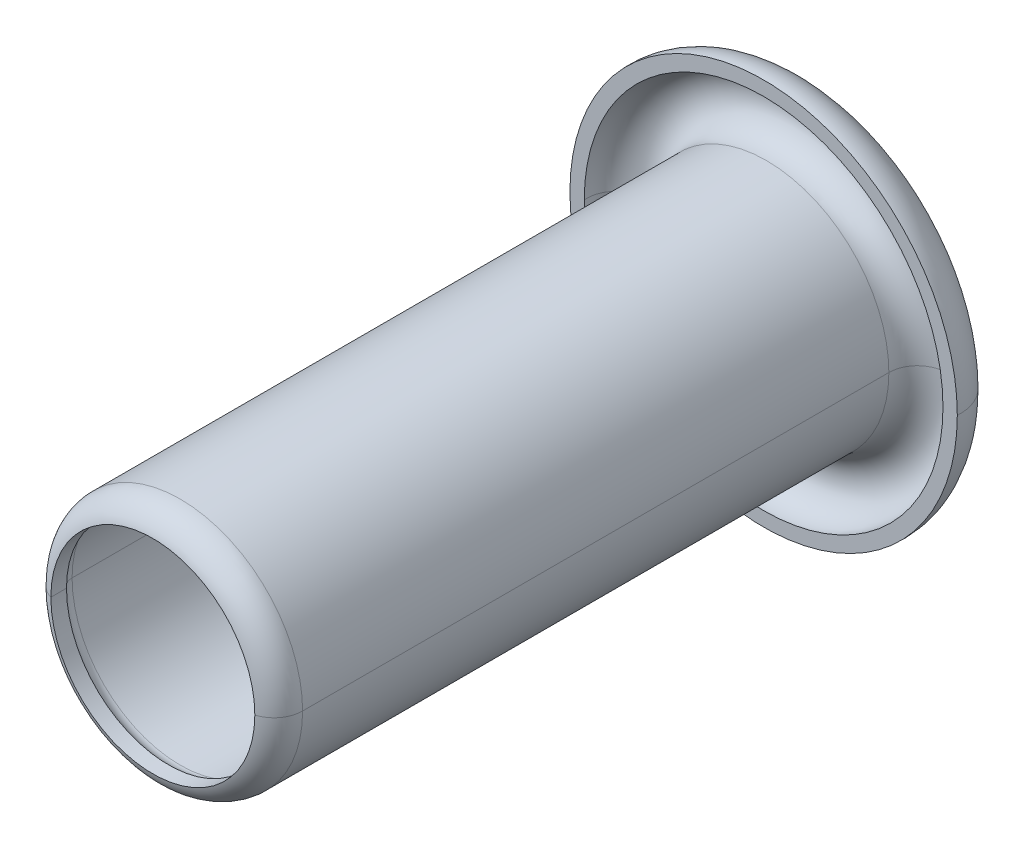
ISO-10303-21;
HEADER;
FILE_DESCRIPTION(('STEP AP214'),'2;1');
FILE_NAME('part.step','',(''),(''),'','','');
FILE_SCHEMA(('AUTOMOTIVE_DESIGN { 1 0 10303 214 1 1 1 1 }'));
ENDSEC;
DATA;
#1=APPLICATION_CONTEXT('core data for automotive mechanical design processes');
#2=APPLICATION_PROTOCOL_DEFINITION('international standard','automotive_design',2000,#1);
#3=PRODUCT_CONTEXT('',#1,'mechanical');
#4=PRODUCT('Part','Part','',(#3));
#5=PRODUCT_RELATED_PRODUCT_CATEGORY('part','',(#4));
#6=PRODUCT_DEFINITION_FORMATION('','',#4);
#7=PRODUCT_DEFINITION_CONTEXT('part definition',#1,'design');
#8=PRODUCT_DEFINITION('design','',#6,#7);
#9=PRODUCT_DEFINITION_SHAPE('','',#8);
#10=(LENGTH_UNIT() NAMED_UNIT(*) SI_UNIT(.MILLI.,.METRE.));
#11=(NAMED_UNIT(*) PLANE_ANGLE_UNIT() SI_UNIT($,.RADIAN.));
#12=(NAMED_UNIT(*) SI_UNIT($,.STERADIAN.) SOLID_ANGLE_UNIT());
#13=UNCERTAINTY_MEASURE_WITH_UNIT(LENGTH_MEASURE(1.E-05),#10,'distance_accuracy_value','');
#14=(GEOMETRIC_REPRESENTATION_CONTEXT(3) GLOBAL_UNCERTAINTY_ASSIGNED_CONTEXT((#13)) GLOBAL_UNIT_ASSIGNED_CONTEXT((#10,
#11,#12)) REPRESENTATION_CONTEXT('',''));
#15=CARTESIAN_POINT('',(0.,0.,0.));
#16=DIRECTION('',(0.,0.,1.));
#17=DIRECTION('',(1.,0.,0.));
#18=AXIS2_PLACEMENT_3D('',#15,#16,#17);
#19=CARTESIAN_POINT('',(-32.,0.,-110.02));
#20=DIRECTION('',(0.,0.,-1.));
#21=DIRECTION('',(-1.,0.,0.));
#22=AXIS2_PLACEMENT_3D('',#19,#20,#21);
#23=CYLINDRICAL_SURFACE('',#22,2.5);
#24=DIRECTION('',(0.,0.,-1.));
#25=VECTOR('',#24,1.);
#26=CARTESIAN_POINT('',(-29.5,0.,-110.02));
#27=LINE('',#26,#25);
#28=CARTESIAN_POINT('',(-29.5,0.,-93.9291796067501));
#29=VERTEX_POINT('',#28);
#30=CARTESIAN_POINT('',(-29.5,0.,-94.3127718676731));
#31=VERTEX_POINT('',#30);
#32=EDGE_CURVE('E119',#29,#31,#27,.T.);
#33=ORIENTED_EDGE('',*,*,#32,.F.);
#34=CARTESIAN_POINT('',(-32.,0.,-93.9291796067501));
#35=DIRECTION('',(0.,0.,-1.));
#36=DIRECTION('',(-1.,0.,0.));
#37=AXIS2_PLACEMENT_3D('',#34,#35,#36);
#38=CIRCLE('',#37,2.5);
#39=CARTESIAN_POINT('',(-34.5,0.,-93.9291796067501));
#40=VERTEX_POINT('',#39);
#41=EDGE_CURVE('E107',#40,#29,#38,.T.);
#42=ORIENTED_EDGE('',*,*,#41,.F.);
#43=DIRECTION('',(0.,0.,-1.));
#44=VECTOR('',#43,1.);
#45=CARTESIAN_POINT('',(-34.5,0.,-110.02));
#46=LINE('',#45,#44);
#47=CARTESIAN_POINT('',(-34.5,0.,-94.3127718676731));
#48=VERTEX_POINT('',#47);
#49=EDGE_CURVE('E128',#40,#48,#46,.T.);
#50=ORIENTED_EDGE('',*,*,#49,.T.);
#51=CARTESIAN_POINT('',(-32.,0.,-94.3127718676731));
#52=DIRECTION('',(0.,0.,1.));
#53=DIRECTION('',(-1.,0.,0.));
#54=AXIS2_PLACEMENT_3D('',#51,#52,#53);
#55=CIRCLE('',#54,2.5);
#56=EDGE_CURVE('E120',#31,#48,#55,.T.);
#57=ORIENTED_EDGE('',*,*,#56,.F.);
#58=EDGE_LOOP('',(#33,#42,#50,#57));
#59=FACE_BOUND('',#58,.T.);
#60=ADVANCED_FACE('F17',(#59),#23,.F.);
#61=CARTESIAN_POINT('',(-32.,4.39649120597465,-108.9));
#62=DIRECTION('',(0.,0.,1.));
#63=DIRECTION('',(0.,1.,0.));
#64=AXIS2_PLACEMENT_3D('',#61,#62,#63);
#65=PLANE('',#64);
#66=CARTESIAN_POINT('',(-32.,0.,-108.9));
#67=DIRECTION('',(0.,0.,1.));
#68=DIRECTION('',(1.,0.,0.));
#69=AXIS2_PLACEMENT_3D('',#66,#67,#68);
#70=CIRCLE('',#69,4.39649120597463);
#71=CARTESIAN_POINT('',(-27.6035087940254,0.,-108.9));
#72=VERTEX_POINT('',#71);
#73=CARTESIAN_POINT('',(-36.3964912059746,0.,-108.9));
#74=VERTEX_POINT('',#73);
#75=EDGE_CURVE('E11',#72,#74,#70,.T.);
#76=ORIENTED_EDGE('',*,*,#75,.F.);
#77=CARTESIAN_POINT('',(-32.,0.,-108.9));
#78=DIRECTION('',(0.,0.,1.));
#79=DIRECTION('',(1.,0.,0.));
#80=AXIS2_PLACEMENT_3D('',#77,#78,#79);
#81=CIRCLE('',#80,4.39649120597463);
#82=EDGE_CURVE('E153',#74,#72,#81,.T.);
#83=ORIENTED_EDGE('',*,*,#82,.F.);
#84=EDGE_LOOP('',(#76,#83));
#85=FACE_BOUND('',#84,.T.);
#86=CARTESIAN_POINT('',(-32.,0.,-108.9));
#87=DIRECTION('',(0.,0.,1.));
#88=DIRECTION('',(1.,0.,0.));
#89=AXIS2_PLACEMENT_3D('',#86,#87,#88);
#90=CIRCLE('',#89,4.7476640682967);
#91=CARTESIAN_POINT('',(-27.2523359317033,0.,-108.9));
#92=VERTEX_POINT('',#91);
#93=CARTESIAN_POINT('',(-36.7476640682967,0.,-108.9));
#94=VERTEX_POINT('',#93);
#95=EDGE_CURVE('E191',#92,#94,#90,.T.);
#96=ORIENTED_EDGE('',*,*,#95,.T.);
#97=CARTESIAN_POINT('',(-32.,0.,-108.9));
#98=DIRECTION('',(0.,0.,1.));
#99=DIRECTION('',(1.,0.,0.));
#100=AXIS2_PLACEMENT_3D('',#97,#98,#99);
#101=CIRCLE('',#100,4.7476640682967);
#102=EDGE_CURVE('E26',#94,#92,#101,.T.);
#103=ORIENTED_EDGE('',*,*,#102,.T.);
#104=EDGE_LOOP('',(#96,#103));
#105=FACE_BOUND('',#104,.T.);
#106=ADVANCED_FACE('F260',(#85,#105),#65,.T.);
#107=CARTESIAN_POINT('',(-32.,0.,-108.97));
#108=DIRECTION('',(0.,0.,1.));
#109=DIRECTION('',(1.,0.,0.));
#110=AXIS2_PLACEMENT_3D('',#107,#108,#109);
#111=TOROIDAL_SURFACE('',#110,3.7,0.7);
#112=CARTESIAN_POINT('',(-35.7,0.,-108.97));
#113=DIRECTION('',(0.,1.,0.));
#114=DIRECTION('',(-1.,0.,0.));
#115=AXIS2_PLACEMENT_3D('',#112,#113,#114);
#116=CIRCLE('',#115,0.7);
#117=CARTESIAN_POINT('',(-35.,0.,-108.97));
#118=VERTEX_POINT('',#117);
#119=EDGE_CURVE('E136',#118,#74,#116,.T.);
#120=ORIENTED_EDGE('',*,*,#119,.F.);
#121=CARTESIAN_POINT('',(-32.,0.,-108.97));
#122=DIRECTION('',(0.,0.,1.));
#123=DIRECTION('',(1.,0.,0.));
#124=AXIS2_PLACEMENT_3D('',#121,#122,#123);
#125=CIRCLE('',#124,3.);
#126=CARTESIAN_POINT('',(-29.,0.,-108.97));
#127=VERTEX_POINT('',#126);
#128=EDGE_CURVE('E164',#127,#118,#125,.T.);
#129=ORIENTED_EDGE('',*,*,#128,.F.);
#130=CARTESIAN_POINT('',(-28.3,0.,-108.97));
#131=DIRECTION('',(0.,-1.,0.));
#132=DIRECTION('',(1.,0.,0.));
#133=AXIS2_PLACEMENT_3D('',#130,#131,#132);
#134=CIRCLE('',#133,0.7);
#135=EDGE_CURVE('E157',#127,#72,#134,.T.);
#136=ORIENTED_EDGE('',*,*,#135,.T.);
#137=ORIENTED_EDGE('',*,*,#75,.T.);
#138=EDGE_LOOP('',(#120,#129,#136,#137));
#139=FACE_BOUND('',#138,.T.);
#140=ADVANCED_FACE('F265',(#139),#111,.F.);
#141=CARTESIAN_POINT('',(-32.,0.,-93.9));
#142=DIRECTION('',(0.,0.,1.));
#143=DIRECTION('',(1.,0.,0.));
#144=AXIS2_PLACEMENT_3D('',#141,#142,#143);
#145=CYLINDRICAL_SURFACE('',#144,3.);
#146=DIRECTION('',(0.,0.,1.));
#147=VECTOR('',#146,1.);
#148=CARTESIAN_POINT('',(-35.,0.,-93.9));
#149=LINE('',#148,#147);
#150=CARTESIAN_POINT('',(-35.,0.,-94.6));
#151=VERTEX_POINT('',#150);
#152=EDGE_CURVE('E152',#118,#151,#149,.T.);
#153=ORIENTED_EDGE('',*,*,#152,.F.);
#154=CARTESIAN_POINT('',(-32.,0.,-108.97));
#155=DIRECTION('',(0.,0.,1.));
#156=DIRECTION('',(1.,0.,0.));
#157=AXIS2_PLACEMENT_3D('',#154,#155,#156);
#158=CIRCLE('',#157,3.);
#159=EDGE_CURVE('E144',#118,#127,#158,.T.);
#160=ORIENTED_EDGE('',*,*,#159,.T.);
#161=DIRECTION('',(0.,0.,1.));
#162=VECTOR('',#161,1.);
#163=CARTESIAN_POINT('',(-29.,0.,-93.9));
#164=LINE('',#163,#162);
#165=CARTESIAN_POINT('',(-29.,0.,-94.6));
#166=VERTEX_POINT('',#165);
#167=EDGE_CURVE('E151',#127,#166,#164,.T.);
#168=ORIENTED_EDGE('',*,*,#167,.T.);
#169=CARTESIAN_POINT('',(-32.,0.,-94.6));
#170=DIRECTION('',(0.,0.,1.));
#171=DIRECTION('',(1.,0.,0.));
#172=AXIS2_PLACEMENT_3D('',#169,#170,#171);
#173=CIRCLE('',#172,3.);
#174=EDGE_CURVE('E101',#151,#166,#173,.T.);
#175=ORIENTED_EDGE('',*,*,#174,.F.);
#176=EDGE_LOOP('',(#153,#160,#168,#175));
#177=FACE_BOUND('',#176,.T.);
#178=ADVANCED_FACE('F329',(#177),#145,.T.);
#179=CARTESIAN_POINT('',(-32.,0.,-93.9));
#180=DIRECTION('',(0.,0.,1.));
#181=DIRECTION('',(1.,0.,0.));
#182=AXIS2_PLACEMENT_3D('',#179,#180,#181);
#183=CYLINDRICAL_SURFACE('',#182,2.65);
#184=DIRECTION('',(0.,0.,1.));
#185=VECTOR('',#184,1.);
#186=CARTESIAN_POINT('',(-34.65,0.,-93.9));
#187=LINE('',#186,#185);
#188=CARTESIAN_POINT('',(-34.65,0.,-108.97));
#189=VERTEX_POINT('',#188);
#190=CARTESIAN_POINT('',(-34.65,0.,-94.6));
#191=VERTEX_POINT('',#190);
#192=EDGE_CURVE('E168',#189,#191,#187,.T.);
#193=ORIENTED_EDGE('',*,*,#192,.F.);
#194=CARTESIAN_POINT('',(-32.,0.,-108.97));
#195=DIRECTION('',(0.,0.,1.));
#196=DIRECTION('',(1.,0.,0.));
#197=AXIS2_PLACEMENT_3D('',#194,#195,#196);
#198=CIRCLE('',#197,2.65);
#199=CARTESIAN_POINT('',(-29.35,0.,-108.97));
#200=VERTEX_POINT('',#199);
#201=EDGE_CURVE('E183',#200,#189,#198,.T.);
#202=ORIENTED_EDGE('',*,*,#201,.F.);
#203=DIRECTION('',(0.,0.,1.));
#204=VECTOR('',#203,1.);
#205=CARTESIAN_POINT('',(-29.35,0.,-93.9));
#206=LINE('',#205,#204);
#207=CARTESIAN_POINT('',(-29.35,0.,-94.6));
#208=VERTEX_POINT('',#207);
#209=EDGE_CURVE('E179',#200,#208,#206,.T.);
#210=ORIENTED_EDGE('',*,*,#209,.T.);
#211=CARTESIAN_POINT('',(-32.,0.,-94.6));
#212=DIRECTION('',(0.,0.,1.));
#213=DIRECTION('',(1.,0.,0.));
#214=AXIS2_PLACEMENT_3D('',#211,#212,#213);
#215=CIRCLE('',#214,2.65);
#216=EDGE_CURVE('E205',#208,#191,#215,.T.);
#217=ORIENTED_EDGE('',*,*,#216,.T.);
#218=EDGE_LOOP('',(#193,#202,#210,#217));
#219=FACE_BOUND('',#218,.T.);
#220=ADVANCED_FACE('F296',(#219),#183,.F.);
#221=CARTESIAN_POINT('',(-32.,0.,-108.97));
#222=DIRECTION('',(0.,0.,1.));
#223=DIRECTION('',(1.,0.,0.));
#224=AXIS2_PLACEMENT_3D('',#221,#222,#223);
#225=TOROIDAL_SURFACE('',#224,3.7,1.05);
#226=CARTESIAN_POINT('',(-35.7,0.,-108.97));
#227=DIRECTION('',(0.,1.,0.));
#228=DIRECTION('',(-1.,0.,0.));
#229=AXIS2_PLACEMENT_3D('',#226,#227,#228);
#230=CIRCLE('',#229,1.05);
#231=EDGE_CURVE('E187',#189,#94,#230,.T.);
#232=ORIENTED_EDGE('',*,*,#231,.F.);
#233=CARTESIAN_POINT('',(-32.,0.,-108.97));
#234=DIRECTION('',(0.,0.,1.));
#235=DIRECTION('',(1.,0.,0.));
#236=AXIS2_PLACEMENT_3D('',#233,#234,#235);
#237=CIRCLE('',#236,2.65);
#238=EDGE_CURVE('E160',#189,#200,#237,.T.);
#239=ORIENTED_EDGE('',*,*,#238,.T.);
#240=CARTESIAN_POINT('',(-28.3,0.,-108.97));
#241=DIRECTION('',(0.,-1.,0.));
#242=DIRECTION('',(1.,0.,0.));
#243=AXIS2_PLACEMENT_3D('',#240,#241,#242);
#244=CIRCLE('',#243,1.05);
#245=EDGE_CURVE('E194',#200,#92,#244,.T.);
#246=ORIENTED_EDGE('',*,*,#245,.T.);
#247=ORIENTED_EDGE('',*,*,#102,.F.);
#248=EDGE_LOOP('',(#232,#239,#246,#247));
#249=FACE_BOUND('',#248,.T.);
#250=ADVANCED_FACE('F221',(#249),#225,.T.);
#251=CARTESIAN_POINT('',(-32.,0.,-94.6));
#252=DIRECTION('',(0.,0.,1.));
#253=DIRECTION('',(1.,0.,0.));
#254=AXIS2_PLACEMENT_3D('',#251,#252,#253);
#255=TOROIDAL_SURFACE('',#254,2.3,0.7);
#256=CARTESIAN_POINT('',(-34.3,0.,-94.6));
#257=DIRECTION('',(0.,1.,0.));
#258=DIRECTION('',(-1.,0.,0.));
#259=AXIS2_PLACEMENT_3D('',#256,#257,#258);
#260=CIRCLE('',#259,0.7);
#261=EDGE_CURVE('E112',#151,#40,#260,.T.);
#262=ORIENTED_EDGE('',*,*,#261,.F.);
#263=ORIENTED_EDGE('',*,*,#174,.T.);
#264=CARTESIAN_POINT('',(-29.7,0.,-94.6));
#265=DIRECTION('',(0.,-1.,0.));
#266=DIRECTION('',(1.,0.,0.));
#267=AXIS2_PLACEMENT_3D('',#264,#265,#266);
#268=CIRCLE('',#267,0.7);
#269=EDGE_CURVE('E95',#166,#29,#268,.T.);
#270=ORIENTED_EDGE('',*,*,#269,.T.);
#271=CARTESIAN_POINT('',(-32.,0.,-93.9291796067501));
#272=DIRECTION('',(0.,0.,-1.));
#273=DIRECTION('',(-1.,0.,0.));
#274=AXIS2_PLACEMENT_3D('',#271,#272,#273);
#275=CIRCLE('',#274,2.5);
#276=EDGE_CURVE('E100',#29,#40,#275,.T.);
#277=ORIENTED_EDGE('',*,*,#276,.T.);
#278=EDGE_LOOP('',(#262,#263,#270,#277));
#279=FACE_BOUND('',#278,.T.);
#280=ADVANCED_FACE('F98',(#279),#255,.T.);
#281=CARTESIAN_POINT('',(-32.,0.,-94.6));
#282=DIRECTION('',(0.,0.,1.));
#283=DIRECTION('',(1.,0.,0.));
#284=AXIS2_PLACEMENT_3D('',#281,#282,#283);
#285=TOROIDAL_SURFACE('',#284,2.3,0.35);
#286=CARTESIAN_POINT('',(-34.3,0.,-94.6));
#287=DIRECTION('',(0.,1.,0.));
#288=DIRECTION('',(-1.,0.,0.));
#289=AXIS2_PLACEMENT_3D('',#286,#287,#288);
#290=CIRCLE('',#289,0.35);
#291=EDGE_CURVE('E106',#191,#48,#290,.T.);
#292=ORIENTED_EDGE('',*,*,#291,.F.);
#293=ORIENTED_EDGE('',*,*,#216,.F.);
#294=CARTESIAN_POINT('',(-29.7,0.,-94.6));
#295=DIRECTION('',(0.,-1.,0.));
#296=DIRECTION('',(1.,0.,0.));
#297=AXIS2_PLACEMENT_3D('',#294,#295,#296);
#298=CIRCLE('',#297,0.35);
#299=EDGE_CURVE('E202',#208,#31,#298,.T.);
#300=ORIENTED_EDGE('',*,*,#299,.T.);
#301=ORIENTED_EDGE('',*,*,#56,.T.);
#302=EDGE_LOOP('',(#292,#293,#300,#301));
#303=FACE_BOUND('',#302,.T.);
#304=ADVANCED_FACE('F220',(#303),#285,.F.);
#305=CARTESIAN_POINT('',(-32.,0.,-94.6));
#306=DIRECTION('',(0.,0.,1.));
#307=DIRECTION('',(1.,0.,0.));
#308=AXIS2_PLACEMENT_3D('',#305,#306,#307);
#309=TOROIDAL_SURFACE('',#308,2.3,0.35);
#310=CARTESIAN_POINT('',(-32.,0.,-94.6));
#311=DIRECTION('',(0.,0.,1.));
#312=DIRECTION('',(1.,0.,0.));
#313=AXIS2_PLACEMENT_3D('',#310,#311,#312);
#314=CIRCLE('',#313,2.65);
#315=EDGE_CURVE('E175',#191,#208,#314,.T.);
#316=ORIENTED_EDGE('',*,*,#315,.F.);
#317=ORIENTED_EDGE('',*,*,#291,.T.);
#318=CARTESIAN_POINT('',(-32.,0.,-94.3127718676731));
#319=DIRECTION('',(0.,0.,1.));
#320=DIRECTION('',(-1.,0.,0.));
#321=AXIS2_PLACEMENT_3D('',#318,#319,#320);
#322=CIRCLE('',#321,2.5);
#323=EDGE_CURVE('E125',#48,#31,#322,.T.);
#324=ORIENTED_EDGE('',*,*,#323,.T.);
#325=ORIENTED_EDGE('',*,*,#299,.F.);
#326=EDGE_LOOP('',(#316,#317,#324,#325));
#327=FACE_BOUND('',#326,.T.);
#328=ADVANCED_FACE('F229',(#327),#309,.F.);
#329=CARTESIAN_POINT('',(-32.,0.,-94.6));
#330=DIRECTION('',(0.,0.,1.));
#331=DIRECTION('',(1.,0.,0.));
#332=AXIS2_PLACEMENT_3D('',#329,#330,#331);
#333=TOROIDAL_SURFACE('',#332,2.3,0.7);
#334=CARTESIAN_POINT('',(-32.,0.,-94.6));
#335=DIRECTION('',(0.,0.,1.));
#336=DIRECTION('',(1.,0.,0.));
#337=AXIS2_PLACEMENT_3D('',#334,#335,#336);
#338=CIRCLE('',#337,3.);
#339=EDGE_CURVE('E148',#166,#151,#338,.T.);
#340=ORIENTED_EDGE('',*,*,#339,.T.);
#341=ORIENTED_EDGE('',*,*,#261,.T.);
#342=ORIENTED_EDGE('',*,*,#41,.T.);
#343=ORIENTED_EDGE('',*,*,#269,.F.);
#344=EDGE_LOOP('',(#340,#341,#342,#343));
#345=FACE_BOUND('',#344,.T.);
#346=ADVANCED_FACE('F111',(#345),#333,.T.);
#347=CARTESIAN_POINT('',(-32.,0.,-108.97));
#348=DIRECTION('',(0.,0.,1.));
#349=DIRECTION('',(1.,0.,0.));
#350=AXIS2_PLACEMENT_3D('',#347,#348,#349);
#351=TOROIDAL_SURFACE('',#350,3.7,1.05);
#352=ORIENTED_EDGE('',*,*,#201,.T.);
#353=ORIENTED_EDGE('',*,*,#231,.T.);
#354=ORIENTED_EDGE('',*,*,#95,.F.);
#355=ORIENTED_EDGE('',*,*,#245,.F.);
#356=EDGE_LOOP('',(#352,#353,#354,#355));
#357=FACE_BOUND('',#356,.T.);
#358=ADVANCED_FACE('F278',(#357),#351,.T.);
#359=CARTESIAN_POINT('',(-32.,0.,-93.9));
#360=DIRECTION('',(0.,0.,1.));
#361=DIRECTION('',(1.,0.,0.));
#362=AXIS2_PLACEMENT_3D('',#359,#360,#361);
#363=CYLINDRICAL_SURFACE('',#362,2.65);
#364=ORIENTED_EDGE('',*,*,#238,.F.);
#365=ORIENTED_EDGE('',*,*,#192,.T.);
#366=ORIENTED_EDGE('',*,*,#315,.T.);
#367=ORIENTED_EDGE('',*,*,#209,.F.);
#368=EDGE_LOOP('',(#364,#365,#366,#367));
#369=FACE_BOUND('',#368,.T.);
#370=ADVANCED_FACE('F273',(#369),#363,.F.);
#371=CARTESIAN_POINT('',(-32.,0.,-93.9));
#372=DIRECTION('',(0.,0.,1.));
#373=DIRECTION('',(1.,0.,0.));
#374=AXIS2_PLACEMENT_3D('',#371,#372,#373);
#375=CYLINDRICAL_SURFACE('',#374,3.);
#376=ORIENTED_EDGE('',*,*,#128,.T.);
#377=ORIENTED_EDGE('',*,*,#152,.T.);
#378=ORIENTED_EDGE('',*,*,#339,.F.);
#379=ORIENTED_EDGE('',*,*,#167,.F.);
#380=EDGE_LOOP('',(#376,#377,#378,#379));
#381=FACE_BOUND('',#380,.T.);
#382=ADVANCED_FACE('F253',(#381),#375,.T.);
#383=CARTESIAN_POINT('',(-32.,0.,-108.97));
#384=DIRECTION('',(0.,0.,1.));
#385=DIRECTION('',(1.,0.,0.));
#386=AXIS2_PLACEMENT_3D('',#383,#384,#385);
#387=TOROIDAL_SURFACE('',#386,3.7,0.7);
#388=ORIENTED_EDGE('',*,*,#159,.F.);
#389=ORIENTED_EDGE('',*,*,#119,.T.);
#390=ORIENTED_EDGE('',*,*,#82,.T.);
#391=ORIENTED_EDGE('',*,*,#135,.F.);
#392=EDGE_LOOP('',(#388,#389,#390,#391));
#393=FACE_BOUND('',#392,.T.);
#394=ADVANCED_FACE('F244',(#393),#387,.F.);
#395=CARTESIAN_POINT('',(-32.,0.,-110.02));
#396=DIRECTION('',(0.,0.,-1.));
#397=DIRECTION('',(-1.,0.,0.));
#398=AXIS2_PLACEMENT_3D('',#395,#396,#397);
#399=CYLINDRICAL_SURFACE('',#398,2.5);
#400=ORIENTED_EDGE('',*,*,#276,.F.);
#401=ORIENTED_EDGE('',*,*,#32,.T.);
#402=ORIENTED_EDGE('',*,*,#323,.F.);
#403=ORIENTED_EDGE('',*,*,#49,.F.);
#404=EDGE_LOOP('',(#400,#401,#402,#403));
#405=FACE_BOUND('',#404,.T.);
#406=ADVANCED_FACE('F127',(#405),#399,.F.);
#407=CLOSED_SHELL('',(#60,#106,#140,#178,#220,#250,#280,#304,#328,#346,#358,#370,#382,#394,#406));
#408=MANIFOLD_SOLID_BREP('B1',#407);
#409=ADVANCED_BREP_SHAPE_REPRESENTATION('',(#18,#408),#14);
#410=SHAPE_DEFINITION_REPRESENTATION(#9,#409);
ENDSEC;
END-ISO-10303-21;
